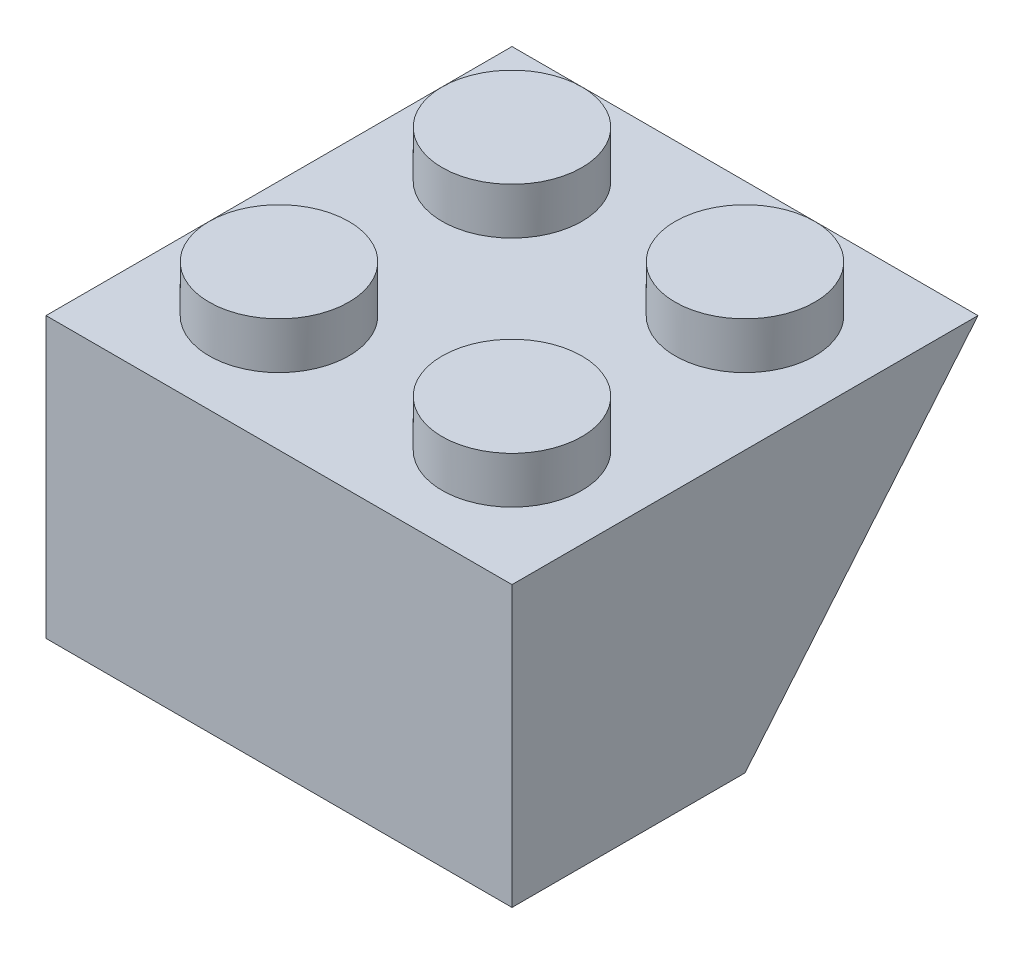
ISO-10303-21;
HEADER;
FILE_DESCRIPTION(('STEP AP214'),'2;1');
FILE_NAME('part.step','',(''),(''),'','','');
FILE_SCHEMA(('AUTOMOTIVE_DESIGN { 1 0 10303 214 1 1 1 1 }'));
ENDSEC;
DATA;
#1=APPLICATION_CONTEXT('core data for automotive mechanical design processes');
#2=APPLICATION_PROTOCOL_DEFINITION('international standard','automotive_design',2000,#1);
#3=PRODUCT_CONTEXT('',#1,'mechanical');
#4=PRODUCT('Part','Part','',(#3));
#5=PRODUCT_RELATED_PRODUCT_CATEGORY('part','',(#4));
#6=PRODUCT_DEFINITION_FORMATION('','',#4);
#7=PRODUCT_DEFINITION_CONTEXT('part definition',#1,'design');
#8=PRODUCT_DEFINITION('design','',#6,#7);
#9=PRODUCT_DEFINITION_SHAPE('','',#8);
#10=(LENGTH_UNIT() NAMED_UNIT(*) SI_UNIT(.MILLI.,.METRE.));
#11=(NAMED_UNIT(*) PLANE_ANGLE_UNIT() SI_UNIT($,.RADIAN.));
#12=(NAMED_UNIT(*) SI_UNIT($,.STERADIAN.) SOLID_ANGLE_UNIT());
#13=UNCERTAINTY_MEASURE_WITH_UNIT(LENGTH_MEASURE(1.E-05),#10,'distance_accuracy_value','');
#14=(GEOMETRIC_REPRESENTATION_CONTEXT(3) GLOBAL_UNCERTAINTY_ASSIGNED_CONTEXT((#13)) GLOBAL_UNIT_ASSIGNED_CONTEXT((#10,
#11,#12)) REPRESENTATION_CONTEXT('',''));
#15=CARTESIAN_POINT('',(0.,0.,0.));
#16=DIRECTION('',(0.,0.,1.));
#17=DIRECTION('',(1.,0.,0.));
#18=AXIS2_PLACEMENT_3D('',#15,#16,#17);
#19=CARTESIAN_POINT('',(0.,0.,0.));
#20=DIRECTION('',(0.,-1.,0.));
#21=DIRECTION('',(0.,0.,-1.));
#22=AXIS2_PLACEMENT_3D('',#19,#20,#21);
#23=PLANE('',#22);
#24=DIRECTION('',(0.,0.,1.));
#25=VECTOR('',#24,1.);
#26=CARTESIAN_POINT('',(0.,0.,0.));
#27=LINE('',#26,#25);
#28=CARTESIAN_POINT('',(0.,0.,-8.));
#29=VERTEX_POINT('',#28);
#30=CARTESIAN_POINT('',(0.,0.,0.));
#31=VERTEX_POINT('',#30);
#32=EDGE_CURVE('E260',#29,#31,#27,.T.);
#33=ORIENTED_EDGE('',*,*,#32,.F.);
#34=DIRECTION('',(-1.,0.,0.));
#35=VECTOR('',#34,1.);
#36=CARTESIAN_POINT('',(0.,0.,-8.));
#37=LINE('',#36,#35);
#38=CARTESIAN_POINT('',(16.,0.,-8.));
#39=VERTEX_POINT('',#38);
#40=EDGE_CURVE('E274',#39,#29,#37,.T.);
#41=ORIENTED_EDGE('',*,*,#40,.F.);
#42=DIRECTION('',(0.,0.,-1.));
#43=VECTOR('',#42,1.);
#44=CARTESIAN_POINT('',(16.,0.,0.));
#45=LINE('',#44,#43);
#46=CARTESIAN_POINT('',(16.,0.,0.));
#47=VERTEX_POINT('',#46);
#48=EDGE_CURVE('E286',#47,#39,#45,.T.);
#49=ORIENTED_EDGE('',*,*,#48,.F.);
#50=DIRECTION('',(1.,0.,0.));
#51=VECTOR('',#50,1.);
#52=CARTESIAN_POINT('',(0.,0.,0.));
#53=LINE('',#52,#51);
#54=EDGE_CURVE('E358',#31,#47,#53,.T.);
#55=ORIENTED_EDGE('',*,*,#54,.F.);
#56=EDGE_LOOP('',(#33,#41,#49,#55));
#57=FACE_BOUND('',#56,.T.);
#58=DIRECTION('',(-1.,0.,0.));
#59=VECTOR('',#58,1.);
#60=CARTESIAN_POINT('',(0.,0.,-5.91726675309156));
#61=LINE('',#60,#59);
#62=CARTESIAN_POINT('',(14.4,0.,-5.91726675309156));
#63=VERTEX_POINT('',#62);
#64=CARTESIAN_POINT('',(1.6,0.,-5.91726675309156));
#65=VERTEX_POINT('',#64);
#66=EDGE_CURVE('E160',#63,#65,#61,.T.);
#67=ORIENTED_EDGE('',*,*,#66,.T.);
#68=DIRECTION('',(0.,0.,1.));
#69=VECTOR('',#68,1.);
#70=CARTESIAN_POINT('',(1.6,0.,0.));
#71=LINE('',#70,#69);
#72=CARTESIAN_POINT('',(1.6,0.,-1.6));
#73=VERTEX_POINT('',#72);
#74=EDGE_CURVE('E154',#65,#73,#71,.T.);
#75=ORIENTED_EDGE('',*,*,#74,.T.);
#76=DIRECTION('',(1.,0.,0.));
#77=VECTOR('',#76,1.);
#78=CARTESIAN_POINT('',(0.,0.,-1.6));
#79=LINE('',#78,#77);
#80=CARTESIAN_POINT('',(14.4,0.,-1.6));
#81=VERTEX_POINT('',#80);
#82=EDGE_CURVE('E188',#73,#81,#79,.T.);
#83=ORIENTED_EDGE('',*,*,#82,.T.);
#84=DIRECTION('',(0.,0.,-1.));
#85=VECTOR('',#84,1.);
#86=CARTESIAN_POINT('',(14.4,0.,0.));
#87=LINE('',#86,#85);
#88=EDGE_CURVE('E67',#81,#63,#87,.T.);
#89=ORIENTED_EDGE('',*,*,#88,.T.);
#90=EDGE_LOOP('',(#67,#75,#83,#89));
#91=FACE_BOUND('',#90,.T.);
#92=ADVANCED_FACE('F51',(#57,#91),#23,.T.);
#93=CARTESIAN_POINT('',(0.,9.6,0.));
#94=DIRECTION('',(0.,-1.,0.));
#95=DIRECTION('',(0.,0.,-1.));
#96=AXIS2_PLACEMENT_3D('',#93,#94,#95);
#97=PLANE('',#96);
#98=CARTESIAN_POINT('',(4.00000000000001,9.6,-12.));
#99=DIRECTION('',(0.,-1.,0.));
#100=DIRECTION('',(0.,0.,-1.));
#101=AXIS2_PLACEMENT_3D('',#98,#99,#100);
#102=CIRCLE('',#101,2.4);
#103=CARTESIAN_POINT('',(4.00000000000001,9.6,-14.4));
#104=VERTEX_POINT('',#103);
#105=EDGE_CURVE('E12',#104,#104,#102,.F.);
#106=ORIENTED_EDGE('',*,*,#105,.F.);
#107=EDGE_LOOP('',(#106));
#108=FACE_BOUND('',#107,.T.);
#109=CARTESIAN_POINT('',(12.,9.6,-12.));
#110=DIRECTION('',(0.,-1.,0.));
#111=DIRECTION('',(0.,0.,-1.));
#112=AXIS2_PLACEMENT_3D('',#109,#110,#111);
#113=CIRCLE('',#112,2.4);
#114=CARTESIAN_POINT('',(12.,9.6,-14.4));
#115=VERTEX_POINT('',#114);
#116=EDGE_CURVE('E60',#115,#115,#113,.F.);
#117=ORIENTED_EDGE('',*,*,#116,.F.);
#118=EDGE_LOOP('',(#117));
#119=FACE_BOUND('',#118,.T.);
#120=CARTESIAN_POINT('',(4.00000000000001,9.6,-4.));
#121=DIRECTION('',(0.,-1.,0.));
#122=DIRECTION('',(0.,0.,-1.));
#123=AXIS2_PLACEMENT_3D('',#120,#121,#122);
#124=CIRCLE('',#123,2.4);
#125=CARTESIAN_POINT('',(4.00000000000001,9.6,-6.4));
#126=VERTEX_POINT('',#125);
#127=EDGE_CURVE('E395',#126,#126,#124,.F.);
#128=ORIENTED_EDGE('',*,*,#127,.F.);
#129=EDGE_LOOP('',(#128));
#130=FACE_BOUND('',#129,.T.);
#131=CARTESIAN_POINT('',(12.,9.6,-4.));
#132=DIRECTION('',(0.,-1.,0.));
#133=DIRECTION('',(0.,0.,-1.));
#134=AXIS2_PLACEMENT_3D('',#131,#132,#133);
#135=CIRCLE('',#134,2.4);
#136=CARTESIAN_POINT('',(12.,9.6,-6.4));
#137=VERTEX_POINT('',#136);
#138=EDGE_CURVE('E362',#137,#137,#135,.F.);
#139=ORIENTED_EDGE('',*,*,#138,.F.);
#140=EDGE_LOOP('',(#139));
#141=FACE_BOUND('',#140,.T.);
#142=DIRECTION('',(0.,0.,1.));
#143=VECTOR('',#142,1.);
#144=CARTESIAN_POINT('',(0.,9.6,0.));
#145=LINE('',#144,#143);
#146=CARTESIAN_POINT('',(0.,9.6,-16.));
#147=VERTEX_POINT('',#146);
#148=CARTESIAN_POINT('',(0.,9.6,0.));
#149=VERTEX_POINT('',#148);
#150=EDGE_CURVE('E215',#147,#149,#145,.T.);
#151=ORIENTED_EDGE('',*,*,#150,.T.);
#152=DIRECTION('',(1.,0.,0.));
#153=VECTOR('',#152,1.);
#154=CARTESIAN_POINT('',(0.,9.6,0.));
#155=LINE('',#154,#153);
#156=CARTESIAN_POINT('',(16.,9.6,0.));
#157=VERTEX_POINT('',#156);
#158=EDGE_CURVE('E220',#149,#157,#155,.T.);
#159=ORIENTED_EDGE('',*,*,#158,.T.);
#160=DIRECTION('',(0.,0.,-1.));
#161=VECTOR('',#160,1.);
#162=CARTESIAN_POINT('',(16.,9.6,0.));
#163=LINE('',#162,#161);
#164=CARTESIAN_POINT('',(16.,9.6,-16.));
#165=VERTEX_POINT('',#164);
#166=EDGE_CURVE('E311',#157,#165,#163,.T.);
#167=ORIENTED_EDGE('',*,*,#166,.T.);
#168=DIRECTION('',(-1.,0.,0.));
#169=VECTOR('',#168,1.);
#170=CARTESIAN_POINT('',(0.,9.6,-16.));
#171=LINE('',#170,#169);
#172=EDGE_CURVE('E327',#165,#147,#171,.T.);
#173=ORIENTED_EDGE('',*,*,#172,.T.);
#174=EDGE_LOOP('',(#151,#159,#167,#173));
#175=FACE_BOUND('',#174,.T.);
#176=ADVANCED_FACE('F404',(#108,#119,#130,#141,#175),#97,.F.);
#177=CARTESIAN_POINT('',(0.,0.,0.));
#178=DIRECTION('',(-1.,0.,0.));
#179=DIRECTION('',(0.,0.,1.));
#180=AXIS2_PLACEMENT_3D('',#177,#178,#179);
#181=PLANE('',#180);
#182=DIRECTION('',(0.,-0.768221279597375,0.640184399664481));
#183=VECTOR('',#182,1.);
#184=CARTESIAN_POINT('',(0.,9.6,-16.));
#185=LINE('',#184,#183);
#186=EDGE_CURVE('E330',#147,#29,#185,.T.);
#187=ORIENTED_EDGE('',*,*,#186,.T.);
#188=ORIENTED_EDGE('',*,*,#32,.T.);
#189=DIRECTION('',(0.,-1.,0.));
#190=VECTOR('',#189,1.);
#191=CARTESIAN_POINT('',(0.,9.6,0.));
#192=LINE('',#191,#190);
#193=EDGE_CURVE('E226',#149,#31,#192,.T.);
#194=ORIENTED_EDGE('',*,*,#193,.F.);
#195=ORIENTED_EDGE('',*,*,#150,.F.);
#196=EDGE_LOOP('',(#187,#188,#194,#195));
#197=FACE_BOUND('',#196,.T.);
#198=ADVANCED_FACE('F239',(#197),#181,.T.);
#199=CARTESIAN_POINT('',(0.,0.,0.));
#200=DIRECTION('',(0.,0.,1.));
#201=DIRECTION('',(1.,0.,0.));
#202=AXIS2_PLACEMENT_3D('',#199,#200,#201);
#203=PLANE('',#202);
#204=ORIENTED_EDGE('',*,*,#193,.T.);
#205=ORIENTED_EDGE('',*,*,#54,.T.);
#206=DIRECTION('',(0.,-1.,0.));
#207=VECTOR('',#206,1.);
#208=CARTESIAN_POINT('',(16.,9.6,0.));
#209=LINE('',#208,#207);
#210=EDGE_CURVE('E75',#157,#47,#209,.T.);
#211=ORIENTED_EDGE('',*,*,#210,.F.);
#212=ORIENTED_EDGE('',*,*,#158,.F.);
#213=EDGE_LOOP('',(#204,#205,#211,#212));
#214=FACE_BOUND('',#213,.T.);
#215=ADVANCED_FACE('F228',(#214),#203,.T.);
#216=CARTESIAN_POINT('',(0.,-3.9344262295082,-4.72131147540984));
#217=DIRECTION('',(0.,-0.64018439966448,-0.768221279597376));
#218=DIRECTION('',(0.,0.768221279597376,-0.64018439966448));
#219=AXIS2_PLACEMENT_3D('',#216,#217,#218);
#220=PLANE('',#219);
#221=DIRECTION('',(0.,-0.768221279597376,0.64018439966448));
#222=VECTOR('',#221,1.);
#223=CARTESIAN_POINT('',(16.,9.6,-16.));
#224=LINE('',#223,#222);
#225=EDGE_CURVE('E314',#165,#39,#224,.T.);
#226=ORIENTED_EDGE('',*,*,#225,.T.);
#227=ORIENTED_EDGE('',*,*,#40,.T.);
#228=ORIENTED_EDGE('',*,*,#186,.F.);
#229=ORIENTED_EDGE('',*,*,#172,.F.);
#230=EDGE_LOOP('',(#226,#227,#228,#229));
#231=FACE_BOUND('',#230,.T.);
#232=ADVANCED_FACE('F238',(#231),#220,.T.);
#233=CARTESIAN_POINT('',(16.,0.,0.));
#234=DIRECTION('',(1.,0.,0.));
#235=DIRECTION('',(0.,1.,0.));
#236=AXIS2_PLACEMENT_3D('',#233,#234,#235);
#237=PLANE('',#236);
#238=ORIENTED_EDGE('',*,*,#210,.T.);
#239=ORIENTED_EDGE('',*,*,#48,.T.);
#240=ORIENTED_EDGE('',*,*,#225,.F.);
#241=ORIENTED_EDGE('',*,*,#166,.F.);
#242=EDGE_LOOP('',(#238,#239,#240,#241));
#243=FACE_BOUND('',#242,.T.);
#244=ADVANCED_FACE('F292',(#243),#237,.T.);
#245=CARTESIAN_POINT('',(12.,11.2,-4.));
#246=DIRECTION('',(0.,-1.,0.));
#247=DIRECTION('',(0.,0.,-1.));
#248=AXIS2_PLACEMENT_3D('',#245,#246,#247);
#249=CYLINDRICAL_SURFACE('',#248,2.4);
#250=CARTESIAN_POINT('',(12.,11.2,-4.));
#251=DIRECTION('',(0.,1.,0.));
#252=DIRECTION('',(0.,0.,1.));
#253=AXIS2_PLACEMENT_3D('',#250,#251,#252);
#254=CIRCLE('',#253,2.4);
#255=CARTESIAN_POINT('',(12.,11.2,-1.6));
#256=VERTEX_POINT('',#255);
#257=EDGE_CURVE('E211',#256,#256,#254,.T.);
#258=ORIENTED_EDGE('',*,*,#257,.F.);
#259=EDGE_LOOP('',(#258));
#260=FACE_BOUND('',#259,.T.);
#261=ORIENTED_EDGE('',*,*,#138,.T.);
#262=EDGE_LOOP('',(#261));
#263=FACE_BOUND('',#262,.T.);
#264=ADVANCED_FACE('F300',(#260,#263),#249,.T.);
#265=CARTESIAN_POINT('',(12.,11.2,-4.));
#266=DIRECTION('',(0.,1.,0.));
#267=DIRECTION('',(0.,0.,1.));
#268=AXIS2_PLACEMENT_3D('',#265,#266,#267);
#269=PLANE('',#268);
#270=ORIENTED_EDGE('',*,*,#257,.T.);
#271=EDGE_LOOP('',(#270));
#272=FACE_BOUND('',#271,.T.);
#273=ADVANCED_FACE('F525',(#272),#269,.T.);
#274=CARTESIAN_POINT('',(4.00000000000001,11.2,-4.));
#275=DIRECTION('',(0.,-1.,0.));
#276=DIRECTION('',(0.,0.,-1.));
#277=AXIS2_PLACEMENT_3D('',#274,#275,#276);
#278=CYLINDRICAL_SURFACE('',#277,2.4);
#279=CARTESIAN_POINT('',(4.00000000000001,11.2,-4.));
#280=DIRECTION('',(0.,1.,0.));
#281=DIRECTION('',(0.,0.,1.));
#282=AXIS2_PLACEMENT_3D('',#279,#280,#281);
#283=CIRCLE('',#282,2.4);
#284=CARTESIAN_POINT('',(4.00000000000001,11.2,-1.6));
#285=VERTEX_POINT('',#284);
#286=EDGE_CURVE('E207',#285,#285,#283,.T.);
#287=ORIENTED_EDGE('',*,*,#286,.F.);
#288=EDGE_LOOP('',(#287));
#289=FACE_BOUND('',#288,.T.);
#290=ORIENTED_EDGE('',*,*,#127,.T.);
#291=EDGE_LOOP('',(#290));
#292=FACE_BOUND('',#291,.T.);
#293=ADVANCED_FACE('F532',(#289,#292),#278,.T.);
#294=CARTESIAN_POINT('',(4.00000000000001,11.2,-4.));
#295=DIRECTION('',(0.,1.,0.));
#296=DIRECTION('',(0.,0.,1.));
#297=AXIS2_PLACEMENT_3D('',#294,#295,#296);
#298=PLANE('',#297);
#299=ORIENTED_EDGE('',*,*,#286,.T.);
#300=EDGE_LOOP('',(#299));
#301=FACE_BOUND('',#300,.T.);
#302=ADVANCED_FACE('F539',(#301),#298,.T.);
#303=CARTESIAN_POINT('',(12.,11.2,-12.));
#304=DIRECTION('',(0.,-1.,0.));
#305=DIRECTION('',(0.,0.,-1.));
#306=AXIS2_PLACEMENT_3D('',#303,#304,#305);
#307=CYLINDRICAL_SURFACE('',#306,2.4);
#308=CARTESIAN_POINT('',(12.,11.2,-12.));
#309=DIRECTION('',(0.,1.,0.));
#310=DIRECTION('',(0.,0.,1.));
#311=AXIS2_PLACEMENT_3D('',#308,#309,#310);
#312=CIRCLE('',#311,2.4);
#313=CARTESIAN_POINT('',(12.,11.2,-9.6));
#314=VERTEX_POINT('',#313);
#315=EDGE_CURVE('E203',#314,#314,#312,.T.);
#316=ORIENTED_EDGE('',*,*,#315,.F.);
#317=EDGE_LOOP('',(#316));
#318=FACE_BOUND('',#317,.T.);
#319=ORIENTED_EDGE('',*,*,#116,.T.);
#320=EDGE_LOOP('',(#319));
#321=FACE_BOUND('',#320,.T.);
#322=ADVANCED_FACE('F402',(#318,#321),#307,.T.);
#323=CARTESIAN_POINT('',(12.,11.2,-12.));
#324=DIRECTION('',(0.,1.,0.));
#325=DIRECTION('',(0.,0.,1.));
#326=AXIS2_PLACEMENT_3D('',#323,#324,#325);
#327=PLANE('',#326);
#328=ORIENTED_EDGE('',*,*,#315,.T.);
#329=EDGE_LOOP('',(#328));
#330=FACE_BOUND('',#329,.T.);
#331=ADVANCED_FACE('F554',(#330),#327,.T.);
#332=CARTESIAN_POINT('',(4.00000000000001,11.2,-12.));
#333=DIRECTION('',(0.,-1.,0.));
#334=DIRECTION('',(0.,0.,-1.));
#335=AXIS2_PLACEMENT_3D('',#332,#333,#334);
#336=CYLINDRICAL_SURFACE('',#335,2.4);
#337=CARTESIAN_POINT('',(4.00000000000001,11.2,-12.));
#338=DIRECTION('',(0.,1.,0.));
#339=DIRECTION('',(0.,0.,1.));
#340=AXIS2_PLACEMENT_3D('',#337,#338,#339);
#341=CIRCLE('',#340,2.4);
#342=CARTESIAN_POINT('',(4.00000000000001,11.2,-9.6));
#343=VERTEX_POINT('',#342);
#344=EDGE_CURVE('E199',#343,#343,#341,.T.);
#345=ORIENTED_EDGE('',*,*,#344,.F.);
#346=EDGE_LOOP('',(#345));
#347=FACE_BOUND('',#346,.T.);
#348=ORIENTED_EDGE('',*,*,#105,.T.);
#349=EDGE_LOOP('',(#348));
#350=FACE_BOUND('',#349,.T.);
#351=ADVANCED_FACE('F562',(#347,#350),#336,.T.);
#352=CARTESIAN_POINT('',(4.00000000000001,11.2,-12.));
#353=DIRECTION('',(0.,1.,0.));
#354=DIRECTION('',(0.,0.,1.));
#355=AXIS2_PLACEMENT_3D('',#352,#353,#354);
#356=PLANE('',#355);
#357=ORIENTED_EDGE('',*,*,#344,.T.);
#358=EDGE_LOOP('',(#357));
#359=FACE_BOUND('',#358,.T.);
#360=ADVANCED_FACE('F570',(#359),#356,.T.);
#361=CARTESIAN_POINT('',(0.,8.,0.));
#362=DIRECTION('',(0.,-1.,0.));
#363=DIRECTION('',(0.,0.,-1.));
#364=AXIS2_PLACEMENT_3D('',#361,#362,#363);
#365=PLANE('',#364);
#366=CARTESIAN_POINT('',(4.00000000000001,8.,-4.));
#367=DIRECTION('',(0.,-1.,0.));
#368=DIRECTION('',(0.,0.,-1.));
#369=AXIS2_PLACEMENT_3D('',#366,#367,#368);
#370=CIRCLE('',#369,0.799999999999999);
#371=CARTESIAN_POINT('',(4.00000000000001,8.,-4.8));
#372=VERTEX_POINT('',#371);
#373=EDGE_CURVE('E442',#372,#372,#370,.F.);
#374=ORIENTED_EDGE('',*,*,#373,.T.);
#375=EDGE_LOOP('',(#374));
#376=FACE_BOUND('',#375,.T.);
#377=CARTESIAN_POINT('',(12.,8.,-4.));
#378=DIRECTION('',(0.,-1.,0.));
#379=DIRECTION('',(0.,0.,-1.));
#380=AXIS2_PLACEMENT_3D('',#377,#378,#379);
#381=CIRCLE('',#380,0.799999999999999);
#382=CARTESIAN_POINT('',(12.,8.,-4.8));
#383=VERTEX_POINT('',#382);
#384=EDGE_CURVE('E191',#383,#383,#381,.F.);
#385=ORIENTED_EDGE('',*,*,#384,.T.);
#386=EDGE_LOOP('',(#385));
#387=FACE_BOUND('',#386,.T.);
#388=DIRECTION('',(0.,0.,1.));
#389=VECTOR('',#388,1.);
#390=CARTESIAN_POINT('',(1.6,8.,0.));
#391=LINE('',#390,#389);
#392=CARTESIAN_POINT('',(1.6,8.,-12.5839334197582));
#393=VERTEX_POINT('',#392);
#394=CARTESIAN_POINT('',(1.6,8.,-1.6));
#395=VERTEX_POINT('',#394);
#396=EDGE_CURVE('E170',#393,#395,#391,.T.);
#397=ORIENTED_EDGE('',*,*,#396,.F.);
#398=DIRECTION('',(-1.,0.,0.));
#399=VECTOR('',#398,1.);
#400=CARTESIAN_POINT('',(0.,8.,-12.5839334197582));
#401=LINE('',#400,#399);
#402=CARTESIAN_POINT('',(3.45317117734208,8.,-12.5839334197582));
#403=VERTEX_POINT('',#402);
#404=EDGE_CURVE('E453',#403,#393,#401,.T.);
#405=ORIENTED_EDGE('',*,*,#404,.F.);
#406=CARTESIAN_POINT('',(4.00000000000001,8.,-12.));
#407=DIRECTION('',(0.,-1.,0.));
#408=DIRECTION('',(0.,0.,-1.));
#409=AXIS2_PLACEMENT_3D('',#406,#407,#408);
#410=CIRCLE('',#409,0.799999999999999);
#411=CARTESIAN_POINT('',(4.54682882265795,8.,-12.5839334197582));
#412=VERTEX_POINT('',#411);
#413=EDGE_CURVE('E196',#403,#412,#410,.F.);
#414=ORIENTED_EDGE('',*,*,#413,.T.);
#415=CARTESIAN_POINT('',(11.4531711773421,8.,-12.5839334197582));
#416=VERTEX_POINT('',#415);
#417=EDGE_CURVE('E456',#416,#412,#401,.T.);
#418=ORIENTED_EDGE('',*,*,#417,.F.);
#419=CARTESIAN_POINT('',(12.,8.,-12.));
#420=DIRECTION('',(0.,-1.,0.));
#421=DIRECTION('',(0.,0.,-1.));
#422=AXIS2_PLACEMENT_3D('',#419,#420,#421);
#423=CIRCLE('',#422,0.799999999999999);
#424=CARTESIAN_POINT('',(12.5468288226579,8.,-12.5839334197582));
#425=VERTEX_POINT('',#424);
#426=EDGE_CURVE('E439',#416,#425,#423,.F.);
#427=ORIENTED_EDGE('',*,*,#426,.T.);
#428=CARTESIAN_POINT('',(14.4,8.,-12.5839334197582));
#429=VERTEX_POINT('',#428);
#430=EDGE_CURVE('E148',#429,#425,#401,.T.);
#431=ORIENTED_EDGE('',*,*,#430,.F.);
#432=DIRECTION('',(0.,0.,-1.));
#433=VECTOR('',#432,1.);
#434=CARTESIAN_POINT('',(14.4,8.,0.));
#435=LINE('',#434,#433);
#436=CARTESIAN_POINT('',(14.4,8.,-1.6));
#437=VERTEX_POINT('',#436);
#438=EDGE_CURVE('E142',#437,#429,#435,.T.);
#439=ORIENTED_EDGE('',*,*,#438,.F.);
#440=DIRECTION('',(1.,0.,0.));
#441=VECTOR('',#440,1.);
#442=CARTESIAN_POINT('',(0.,8.,-1.6));
#443=LINE('',#442,#441);
#444=EDGE_CURVE('E130',#395,#437,#443,.T.);
#445=ORIENTED_EDGE('',*,*,#444,.F.);
#446=EDGE_LOOP('',(#397,#405,#414,#418,#427,#431,#439,#445));
#447=FACE_BOUND('',#446,.T.);
#448=ADVANCED_FACE('F145',(#376,#387,#447),#365,.T.);
#449=CARTESIAN_POINT('',(1.6,0.,0.));
#450=DIRECTION('',(-1.,0.,0.));
#451=DIRECTION('',(0.,0.,1.));
#452=AXIS2_PLACEMENT_3D('',#449,#450,#451);
#453=PLANE('',#452);
#454=DIRECTION('',(0.,-0.768221279597376,0.64018439966448));
#455=VECTOR('',#454,1.);
#456=CARTESIAN_POINT('',(1.6,-2.91013119004503,-3.49215742805403));
#457=LINE('',#456,#455);
#458=EDGE_CURVE('E141',#393,#65,#457,.T.);
#459=ORIENTED_EDGE('',*,*,#458,.F.);
#460=ORIENTED_EDGE('',*,*,#396,.T.);
#461=DIRECTION('',(0.,-1.,0.));
#462=VECTOR('',#461,1.);
#463=CARTESIAN_POINT('',(1.6,0.,-1.6));
#464=LINE('',#463,#462);
#465=EDGE_CURVE('E136',#395,#73,#464,.T.);
#466=ORIENTED_EDGE('',*,*,#465,.T.);
#467=ORIENTED_EDGE('',*,*,#74,.F.);
#468=EDGE_LOOP('',(#459,#460,#466,#467));
#469=FACE_BOUND('',#468,.T.);
#470=ADVANCED_FACE('F464',(#469),#453,.F.);
#471=CARTESIAN_POINT('',(0.,0.,-1.6));
#472=DIRECTION('',(0.,0.,1.));
#473=DIRECTION('',(1.,0.,0.));
#474=AXIS2_PLACEMENT_3D('',#471,#472,#473);
#475=PLANE('',#474);
#476=ORIENTED_EDGE('',*,*,#465,.F.);
#477=ORIENTED_EDGE('',*,*,#444,.T.);
#478=DIRECTION('',(0.,-1.,0.));
#479=VECTOR('',#478,1.);
#480=CARTESIAN_POINT('',(14.4,0.,-1.6));
#481=LINE('',#480,#479);
#482=EDGE_CURVE('E133',#437,#81,#481,.T.);
#483=ORIENTED_EDGE('',*,*,#482,.T.);
#484=ORIENTED_EDGE('',*,*,#82,.F.);
#485=EDGE_LOOP('',(#476,#477,#483,#484));
#486=FACE_BOUND('',#485,.T.);
#487=ADVANCED_FACE('F132',(#486),#475,.F.);
#488=CARTESIAN_POINT('',(0.,-2.91013119004503,-3.49215742805403));
#489=DIRECTION('',(0.,-0.64018439966448,-0.768221279597376));
#490=DIRECTION('',(0.,0.768221279597376,-0.64018439966448));
#491=AXIS2_PLACEMENT_3D('',#488,#489,#490);
#492=PLANE('',#491);
#493=DIRECTION('',(0.,-0.768221279597376,0.64018439966448));
#494=VECTOR('',#493,1.);
#495=CARTESIAN_POINT('',(14.4,-2.91013119004504,-3.49215742805402));
#496=LINE('',#495,#494);
#497=EDGE_CURVE('E155',#429,#63,#496,.T.);
#498=ORIENTED_EDGE('',*,*,#497,.F.);
#499=ORIENTED_EDGE('',*,*,#430,.T.);
#500=CARTESIAN_POINT('',(12.,7.29927989629013,-12.));
#501=DIRECTION('',(0.,-0.64018439966448,-0.768221279597376));
#502=DIRECTION('',(0.,-0.768221279597376,0.64018439966448));
#503=AXIS2_PLACEMENT_3D('',#500,#501,#502);
#504=ELLIPSE('',#503,1.24963994814506,0.799999999999999);
#505=EDGE_CURVE('E192',#416,#425,#504,.T.);
#506=ORIENTED_EDGE('',*,*,#505,.F.);
#507=ORIENTED_EDGE('',*,*,#417,.T.);
#508=CARTESIAN_POINT('',(4.00000000000001,7.29927989629013,-12.));
#509=DIRECTION('',(0.,-0.64018439966448,-0.768221279597376));
#510=DIRECTION('',(0.,-0.768221279597376,0.64018439966448));
#511=AXIS2_PLACEMENT_3D('',#508,#509,#510);
#512=ELLIPSE('',#511,1.24963994814506,0.799999999999999);
#513=EDGE_CURVE('E195',#403,#412,#512,.T.);
#514=ORIENTED_EDGE('',*,*,#513,.F.);
#515=ORIENTED_EDGE('',*,*,#404,.T.);
#516=ORIENTED_EDGE('',*,*,#458,.T.);
#517=ORIENTED_EDGE('',*,*,#66,.F.);
#518=EDGE_LOOP('',(#498,#499,#506,#507,#514,#515,#516,#517));
#519=FACE_BOUND('',#518,.T.);
#520=ADVANCED_FACE('F466',(#519),#492,.F.);
#521=CARTESIAN_POINT('',(14.4,0.,0.));
#522=DIRECTION('',(1.,0.,0.));
#523=DIRECTION('',(0.,1.,0.));
#524=AXIS2_PLACEMENT_3D('',#521,#522,#523);
#525=PLANE('',#524);
#526=ORIENTED_EDGE('',*,*,#482,.F.);
#527=ORIENTED_EDGE('',*,*,#438,.T.);
#528=ORIENTED_EDGE('',*,*,#497,.T.);
#529=ORIENTED_EDGE('',*,*,#88,.F.);
#530=EDGE_LOOP('',(#526,#527,#528,#529));
#531=FACE_BOUND('',#530,.T.);
#532=ADVANCED_FACE('F152',(#531),#525,.F.);
#533=CARTESIAN_POINT('',(12.,11.2,-4.));
#534=DIRECTION('',(0.,-1.,0.));
#535=DIRECTION('',(0.,0.,-1.));
#536=AXIS2_PLACEMENT_3D('',#533,#534,#535);
#537=CYLINDRICAL_SURFACE('',#536,0.799999999999999);
#538=CARTESIAN_POINT('',(12.,9.6,-4.));
#539=DIRECTION('',(0.,1.,0.));
#540=DIRECTION('',(0.,0.,1.));
#541=AXIS2_PLACEMENT_3D('',#538,#539,#540);
#542=CIRCLE('',#541,0.799999999999999);
#543=CARTESIAN_POINT('',(12.,9.6,-3.2));
#544=VERTEX_POINT('',#543);
#545=EDGE_CURVE('E166',#544,#544,#542,.T.);
#546=ORIENTED_EDGE('',*,*,#545,.T.);
#547=EDGE_LOOP('',(#546));
#548=FACE_BOUND('',#547,.T.);
#549=ORIENTED_EDGE('',*,*,#384,.F.);
#550=EDGE_LOOP('',(#549));
#551=FACE_BOUND('',#550,.T.);
#552=ADVANCED_FACE('F608',(#548,#551),#537,.F.);
#553=CARTESIAN_POINT('',(12.,9.6,-4.));
#554=DIRECTION('',(0.,1.,0.));
#555=DIRECTION('',(0.,0.,1.));
#556=AXIS2_PLACEMENT_3D('',#553,#554,#555);
#557=PLANE('',#556);
#558=ORIENTED_EDGE('',*,*,#545,.F.);
#559=EDGE_LOOP('',(#558));
#560=FACE_BOUND('',#559,.T.);
#561=ADVANCED_FACE('F615',(#560),#557,.F.);
#562=CARTESIAN_POINT('',(4.00000000000001,11.2,-4.));
#563=DIRECTION('',(0.,-1.,0.));
#564=DIRECTION('',(0.,0.,-1.));
#565=AXIS2_PLACEMENT_3D('',#562,#563,#564);
#566=CYLINDRICAL_SURFACE('',#565,0.799999999999999);
#567=CARTESIAN_POINT('',(4.00000000000001,9.6,-4.));
#568=DIRECTION('',(0.,1.,0.));
#569=DIRECTION('',(0.,0.,1.));
#570=AXIS2_PLACEMENT_3D('',#567,#568,#569);
#571=CIRCLE('',#570,0.799999999999999);
#572=CARTESIAN_POINT('',(4.00000000000001,9.6,-3.2));
#573=VERTEX_POINT('',#572);
#574=EDGE_CURVE('E171',#573,#573,#571,.T.);
#575=ORIENTED_EDGE('',*,*,#574,.T.);
#576=EDGE_LOOP('',(#575));
#577=FACE_BOUND('',#576,.T.);
#578=ORIENTED_EDGE('',*,*,#373,.F.);
#579=EDGE_LOOP('',(#578));
#580=FACE_BOUND('',#579,.T.);
#581=ADVANCED_FACE('F487',(#577,#580),#566,.F.);
#582=CARTESIAN_POINT('',(4.00000000000001,9.6,-4.));
#583=DIRECTION('',(0.,1.,0.));
#584=DIRECTION('',(0.,0.,1.));
#585=AXIS2_PLACEMENT_3D('',#582,#583,#584);
#586=PLANE('',#585);
#587=ORIENTED_EDGE('',*,*,#574,.F.);
#588=EDGE_LOOP('',(#587));
#589=FACE_BOUND('',#588,.T.);
#590=ADVANCED_FACE('F477',(#589),#586,.F.);
#591=CARTESIAN_POINT('',(12.,11.2,-12.));
#592=DIRECTION('',(0.,-1.,0.));
#593=DIRECTION('',(0.,0.,-1.));
#594=AXIS2_PLACEMENT_3D('',#591,#592,#593);
#595=CYLINDRICAL_SURFACE('',#594,0.799999999999999);
#596=CARTESIAN_POINT('',(12.,9.6,-12.));
#597=DIRECTION('',(0.,1.,0.));
#598=DIRECTION('',(0.,0.,1.));
#599=AXIS2_PLACEMENT_3D('',#596,#597,#598);
#600=CIRCLE('',#599,0.799999999999999);
#601=CARTESIAN_POINT('',(12.,9.6,-11.2));
#602=VERTEX_POINT('',#601);
#603=EDGE_CURVE('E175',#602,#602,#600,.T.);
#604=ORIENTED_EDGE('',*,*,#603,.T.);
#605=EDGE_LOOP('',(#604));
#606=FACE_BOUND('',#605,.T.);
#607=ORIENTED_EDGE('',*,*,#426,.F.);
#608=ORIENTED_EDGE('',*,*,#505,.T.);
#609=EDGE_LOOP('',(#607,#608));
#610=FACE_BOUND('',#609,.T.);
#611=ADVANCED_FACE('F474',(#606,#610),#595,.F.);
#612=CARTESIAN_POINT('',(12.,9.6,-12.));
#613=DIRECTION('',(0.,1.,0.));
#614=DIRECTION('',(0.,0.,1.));
#615=AXIS2_PLACEMENT_3D('',#612,#613,#614);
#616=PLANE('',#615);
#617=ORIENTED_EDGE('',*,*,#603,.F.);
#618=EDGE_LOOP('',(#617));
#619=FACE_BOUND('',#618,.T.);
#620=ADVANCED_FACE('F476',(#619),#616,.F.);
#621=CARTESIAN_POINT('',(4.00000000000001,11.2,-12.));
#622=DIRECTION('',(0.,-1.,0.));
#623=DIRECTION('',(0.,0.,-1.));
#624=AXIS2_PLACEMENT_3D('',#621,#622,#623);
#625=CYLINDRICAL_SURFACE('',#624,0.799999999999999);
#626=CARTESIAN_POINT('',(4.00000000000001,9.6,-12.));
#627=DIRECTION('',(0.,1.,0.));
#628=DIRECTION('',(0.,0.,1.));
#629=AXIS2_PLACEMENT_3D('',#626,#627,#628);
#630=CIRCLE('',#629,0.799999999999999);
#631=CARTESIAN_POINT('',(4.00000000000001,9.6,-11.2));
#632=VERTEX_POINT('',#631);
#633=EDGE_CURVE('E179',#632,#632,#630,.T.);
#634=ORIENTED_EDGE('',*,*,#633,.T.);
#635=EDGE_LOOP('',(#634));
#636=FACE_BOUND('',#635,.T.);
#637=ORIENTED_EDGE('',*,*,#413,.F.);
#638=ORIENTED_EDGE('',*,*,#513,.T.);
#639=EDGE_LOOP('',(#637,#638));
#640=FACE_BOUND('',#639,.T.);
#641=ADVANCED_FACE('F484',(#636,#640),#625,.F.);
#642=CARTESIAN_POINT('',(4.00000000000001,9.6,-12.));
#643=DIRECTION('',(0.,1.,0.));
#644=DIRECTION('',(0.,0.,1.));
#645=AXIS2_PLACEMENT_3D('',#642,#643,#644);
#646=PLANE('',#645);
#647=ORIENTED_EDGE('',*,*,#633,.F.);
#648=EDGE_LOOP('',(#647));
#649=FACE_BOUND('',#648,.T.);
#650=ADVANCED_FACE('F654',(#649),#646,.F.);
#651=CLOSED_SHELL('',(#92,#176,#198,#215,#232,#244,#264,#273,#293,#302,#322,#331,#351,#360,#448,
#470,#487,#520,#532,#552,#561,#581,#590,#611,#620,#641,#650));
#652=MANIFOLD_SOLID_BREP('B2',#651);
#653=ADVANCED_BREP_SHAPE_REPRESENTATION('',(#18,#652),#14);
#654=SHAPE_DEFINITION_REPRESENTATION(#9,#653);
ENDSEC;
END-ISO-10303-21;
